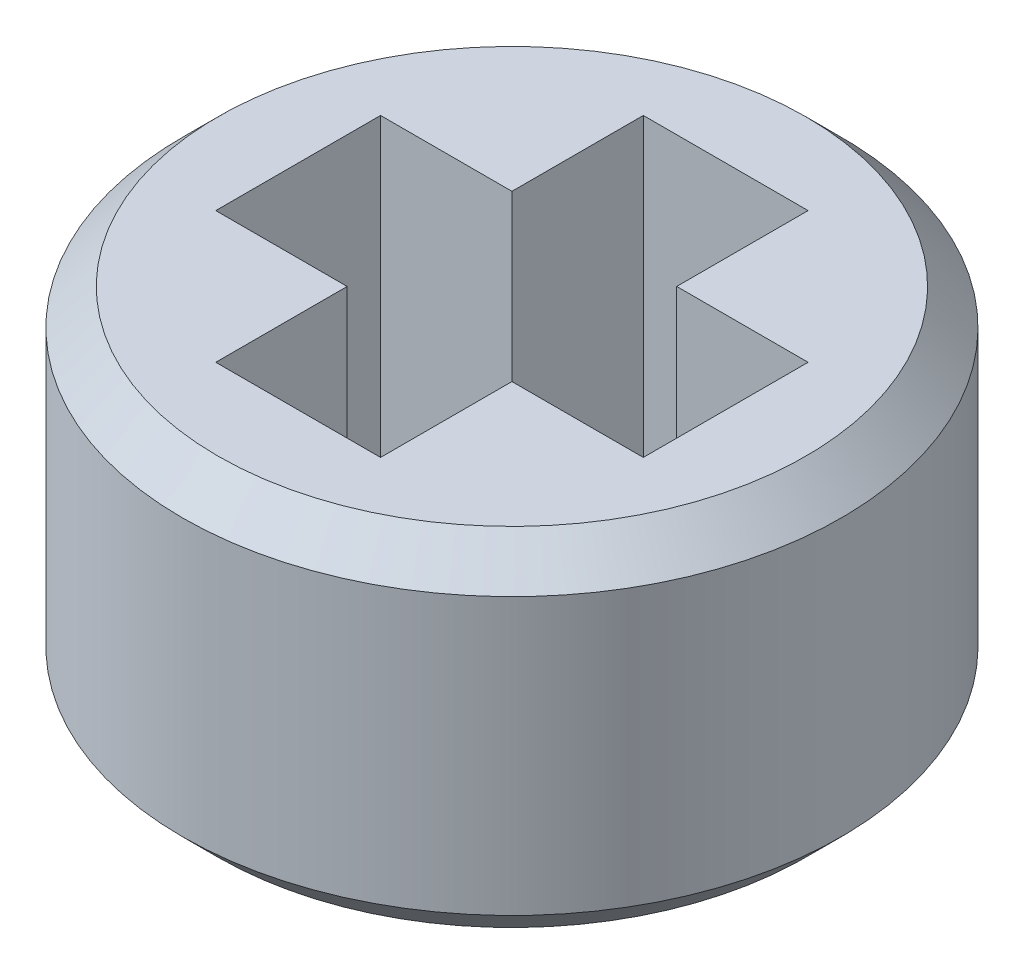
ISO-10303-21;
HEADER;
FILE_DESCRIPTION(('STEP AP214'),'2;1');
FILE_NAME('part.step','',(''),(''),'','','');
FILE_SCHEMA(('AUTOMOTIVE_DESIGN { 1 0 10303 214 1 1 1 1 }'));
ENDSEC;
DATA;
#1=APPLICATION_CONTEXT('core data for automotive mechanical design processes');
#2=APPLICATION_PROTOCOL_DEFINITION('international standard','automotive_design',2000,#1);
#3=PRODUCT_CONTEXT('',#1,'mechanical');
#4=PRODUCT('Part','Part','',(#3));
#5=PRODUCT_RELATED_PRODUCT_CATEGORY('part','',(#4));
#6=PRODUCT_DEFINITION_FORMATION('','',#4);
#7=PRODUCT_DEFINITION_CONTEXT('part definition',#1,'design');
#8=PRODUCT_DEFINITION('design','',#6,#7);
#9=PRODUCT_DEFINITION_SHAPE('','',#8);
#10=(LENGTH_UNIT() NAMED_UNIT(*) SI_UNIT(.MILLI.,.METRE.));
#11=(NAMED_UNIT(*) PLANE_ANGLE_UNIT() SI_UNIT($,.RADIAN.));
#12=(NAMED_UNIT(*) SI_UNIT($,.STERADIAN.) SOLID_ANGLE_UNIT());
#13=UNCERTAINTY_MEASURE_WITH_UNIT(LENGTH_MEASURE(1.E-05),#10,'distance_accuracy_value','');
#14=(GEOMETRIC_REPRESENTATION_CONTEXT(3) GLOBAL_UNCERTAINTY_ASSIGNED_CONTEXT((#13)) GLOBAL_UNIT_ASSIGNED_CONTEXT((#10,
#11,#12)) REPRESENTATION_CONTEXT('',''));
#15=CARTESIAN_POINT('',(0.,0.,0.));
#16=DIRECTION('',(0.,0.,1.));
#17=DIRECTION('',(1.,0.,0.));
#18=AXIS2_PLACEMENT_3D('',#15,#16,#17);
#19=CARTESIAN_POINT('',(0.,1.95,0.));
#20=DIRECTION('',(0.,-1.,0.));
#21=DIRECTION('',(0.,0.,-1.));
#22=AXIS2_PLACEMENT_3D('',#19,#20,#21);
#23=CYLINDRICAL_SURFACE('',#22,3.7);
#24=CARTESIAN_POINT('',(0.,-1.55,0.));
#25=DIRECTION('',(0.,1.,0.));
#26=DIRECTION('',(0.,0.,1.));
#27=AXIS2_PLACEMENT_3D('',#24,#25,#26);
#28=CIRCLE('',#27,3.7);
#29=CARTESIAN_POINT('',(0.,-1.55,3.7));
#30=VERTEX_POINT('',#29);
#31=EDGE_CURVE('E235',#30,#30,#28,.T.);
#32=ORIENTED_EDGE('',*,*,#31,.T.);
#33=EDGE_LOOP('',(#32));
#34=FACE_BOUND('',#33,.T.);
#35=CARTESIAN_POINT('',(0.,1.55,0.));
#36=DIRECTION('',(0.,1.,0.));
#37=DIRECTION('',(0.,0.,1.));
#38=AXIS2_PLACEMENT_3D('',#35,#36,#37);
#39=CIRCLE('',#38,3.7);
#40=CARTESIAN_POINT('',(0.,1.55,3.7));
#41=VERTEX_POINT('',#40);
#42=EDGE_CURVE('E213',#41,#41,#39,.F.);
#43=ORIENTED_EDGE('',*,*,#42,.T.);
#44=EDGE_LOOP('',(#43));
#45=FACE_BOUND('',#44,.T.);
#46=ADVANCED_FACE('F43',(#34,#45),#23,.T.);
#47=CARTESIAN_POINT('',(0.,1.95,0.));
#48=DIRECTION('',(0.,1.,0.));
#49=DIRECTION('',(0.,0.,1.));
#50=AXIS2_PLACEMENT_3D('',#47,#48,#49);
#51=PLANE('',#50);
#52=CARTESIAN_POINT('',(0.,1.95,0.));
#53=DIRECTION('',(0.,1.,0.));
#54=DIRECTION('',(0.,0.,1.));
#55=AXIS2_PLACEMENT_3D('',#52,#53,#54);
#56=CIRCLE('',#55,3.3);
#57=CARTESIAN_POINT('',(0.,1.95,3.3));
#58=VERTEX_POINT('',#57);
#59=EDGE_CURVE('E11',#58,#58,#56,.T.);
#60=ORIENTED_EDGE('',*,*,#59,.T.);
#61=EDGE_LOOP('',(#60));
#62=FACE_BOUND('',#61,.T.);
#63=DIRECTION('',(1.,0.,0.));
#64=VECTOR('',#63,1.);
#65=CARTESIAN_POINT('',(0.925,1.95,0.925));
#66=LINE('',#65,#64);
#67=CARTESIAN_POINT('',(0.925,1.95,0.925));
#68=VERTEX_POINT('',#67);
#69=CARTESIAN_POINT('',(2.4,1.95,0.925));
#70=VERTEX_POINT('',#69);
#71=EDGE_CURVE('E59',#68,#70,#66,.T.);
#72=ORIENTED_EDGE('',*,*,#71,.F.);
#73=DIRECTION('',(0.,0.,-1.));
#74=VECTOR('',#73,1.);
#75=CARTESIAN_POINT('',(0.925,1.95,0.925));
#76=LINE('',#75,#74);
#77=CARTESIAN_POINT('',(0.925,1.95,2.4));
#78=VERTEX_POINT('',#77);
#79=EDGE_CURVE('E151',#78,#68,#76,.T.);
#80=ORIENTED_EDGE('',*,*,#79,.F.);
#81=DIRECTION('',(1.,0.,0.));
#82=VECTOR('',#81,1.);
#83=CARTESIAN_POINT('',(-0.925,1.95,2.4));
#84=LINE('',#83,#82);
#85=CARTESIAN_POINT('',(-0.925,1.95,2.4));
#86=VERTEX_POINT('',#85);
#87=EDGE_CURVE('E154',#86,#78,#84,.T.);
#88=ORIENTED_EDGE('',*,*,#87,.F.);
#89=DIRECTION('',(0.,0.,1.));
#90=VECTOR('',#89,1.);
#91=CARTESIAN_POINT('',(-0.925,1.95,0.925));
#92=LINE('',#91,#90);
#93=CARTESIAN_POINT('',(-0.925,1.95,0.925));
#94=VERTEX_POINT('',#93);
#95=EDGE_CURVE('E206',#94,#86,#92,.T.);
#96=ORIENTED_EDGE('',*,*,#95,.F.);
#97=DIRECTION('',(1.,0.,0.));
#98=VECTOR('',#97,1.);
#99=CARTESIAN_POINT('',(-2.4,1.95,0.925));
#100=LINE('',#99,#98);
#101=CARTESIAN_POINT('',(-2.4,1.95,0.925));
#102=VERTEX_POINT('',#101);
#103=EDGE_CURVE('E203',#102,#94,#100,.T.);
#104=ORIENTED_EDGE('',*,*,#103,.F.);
#105=DIRECTION('',(0.,0.,1.));
#106=VECTOR('',#105,1.);
#107=CARTESIAN_POINT('',(-2.4,1.95,-0.925));
#108=LINE('',#107,#106);
#109=CARTESIAN_POINT('',(-2.4,1.95,-0.925));
#110=VERTEX_POINT('',#109);
#111=EDGE_CURVE('E200',#110,#102,#108,.T.);
#112=ORIENTED_EDGE('',*,*,#111,.F.);
#113=DIRECTION('',(-1.,0.,0.));
#114=VECTOR('',#113,1.);
#115=CARTESIAN_POINT('',(-2.4,1.95,-0.925));
#116=LINE('',#115,#114);
#117=CARTESIAN_POINT('',(-0.925,1.95,-0.925));
#118=VERTEX_POINT('',#117);
#119=EDGE_CURVE('E197',#118,#110,#116,.T.);
#120=ORIENTED_EDGE('',*,*,#119,.F.);
#121=DIRECTION('',(0.,0.,1.));
#122=VECTOR('',#121,1.);
#123=CARTESIAN_POINT('',(-0.925000000000001,1.95,-2.4));
#124=LINE('',#123,#122);
#125=CARTESIAN_POINT('',(-0.925000000000001,1.95,-2.4));
#126=VERTEX_POINT('',#125);
#127=EDGE_CURVE('E194',#126,#118,#124,.T.);
#128=ORIENTED_EDGE('',*,*,#127,.F.);
#129=DIRECTION('',(-1.,0.,0.));
#130=VECTOR('',#129,1.);
#131=CARTESIAN_POINT('',(-0.925000000000001,1.95,-2.4));
#132=LINE('',#131,#130);
#133=CARTESIAN_POINT('',(0.924999999999999,1.95,-2.4));
#134=VERTEX_POINT('',#133);
#135=EDGE_CURVE('E191',#134,#126,#132,.T.);
#136=ORIENTED_EDGE('',*,*,#135,.F.);
#137=DIRECTION('',(0.,0.,-1.));
#138=VECTOR('',#137,1.);
#139=CARTESIAN_POINT('',(0.924999999999999,1.95,-2.4));
#140=LINE('',#139,#138);
#141=CARTESIAN_POINT('',(0.924999999999999,1.95,-0.925));
#142=VERTEX_POINT('',#141);
#143=EDGE_CURVE('E188',#142,#134,#140,.T.);
#144=ORIENTED_EDGE('',*,*,#143,.F.);
#145=DIRECTION('',(-1.,0.,0.));
#146=VECTOR('',#145,1.);
#147=CARTESIAN_POINT('',(0.924999999999999,1.95,-0.925));
#148=LINE('',#147,#146);
#149=CARTESIAN_POINT('',(2.4,1.95,-0.925));
#150=VERTEX_POINT('',#149);
#151=EDGE_CURVE('E185',#150,#142,#148,.T.);
#152=ORIENTED_EDGE('',*,*,#151,.F.);
#153=DIRECTION('',(0.,0.,-1.));
#154=VECTOR('',#153,1.);
#155=CARTESIAN_POINT('',(2.4,1.95,-0.925));
#156=LINE('',#155,#154);
#157=EDGE_CURVE('E183',#70,#150,#156,.T.);
#158=ORIENTED_EDGE('',*,*,#157,.F.);
#159=EDGE_LOOP('',(#72,#80,#88,#96,#104,#112,#120,#128,#136,#144,#152,#158));
#160=FACE_BOUND('',#159,.T.);
#161=ADVANCED_FACE('F248',(#62,#160),#51,.T.);
#162=CARTESIAN_POINT('',(0.,-1.95,0.));
#163=DIRECTION('',(0.,1.,0.));
#164=DIRECTION('',(0.,0.,1.));
#165=AXIS2_PLACEMENT_3D('',#162,#163,#164);
#166=PLANE('',#165);
#167=CARTESIAN_POINT('',(0.,-1.95,0.));
#168=DIRECTION('',(0.,1.,0.));
#169=DIRECTION('',(0.,0.,1.));
#170=AXIS2_PLACEMENT_3D('',#167,#168,#169);
#171=CIRCLE('',#170,3.3);
#172=CARTESIAN_POINT('',(0.,-1.95,3.3));
#173=VERTEX_POINT('',#172);
#174=EDGE_CURVE('E52',#173,#173,#171,.F.);
#175=ORIENTED_EDGE('',*,*,#174,.T.);
#176=EDGE_LOOP('',(#175));
#177=FACE_BOUND('',#176,.T.);
#178=DIRECTION('',(0.,0.,-1.));
#179=VECTOR('',#178,1.);
#180=CARTESIAN_POINT('',(0.925,-1.95,0.925));
#181=LINE('',#180,#179);
#182=CARTESIAN_POINT('',(0.925,-1.95,2.4));
#183=VERTEX_POINT('',#182);
#184=CARTESIAN_POINT('',(0.925,-1.95,0.925));
#185=VERTEX_POINT('',#184);
#186=EDGE_CURVE('E141',#183,#185,#181,.T.);
#187=ORIENTED_EDGE('',*,*,#186,.T.);
#188=DIRECTION('',(1.,0.,0.));
#189=VECTOR('',#188,1.);
#190=CARTESIAN_POINT('',(0.925,-1.95,0.925));
#191=LINE('',#190,#189);
#192=CARTESIAN_POINT('',(2.4,-1.95,0.925));
#193=VERTEX_POINT('',#192);
#194=EDGE_CURVE('E135',#185,#193,#191,.T.);
#195=ORIENTED_EDGE('',*,*,#194,.T.);
#196=DIRECTION('',(0.,0.,-1.));
#197=VECTOR('',#196,1.);
#198=CARTESIAN_POINT('',(2.4,-1.95,-0.925));
#199=LINE('',#198,#197);
#200=CARTESIAN_POINT('',(2.4,-1.95,-0.925));
#201=VERTEX_POINT('',#200);
#202=EDGE_CURVE('E144',#193,#201,#199,.T.);
#203=ORIENTED_EDGE('',*,*,#202,.T.);
#204=DIRECTION('',(-1.,0.,0.));
#205=VECTOR('',#204,1.);
#206=CARTESIAN_POINT('',(0.924999999999999,-1.95,-0.925));
#207=LINE('',#206,#205);
#208=CARTESIAN_POINT('',(0.924999999999999,-1.95,-0.925));
#209=VERTEX_POINT('',#208);
#210=EDGE_CURVE('E67',#201,#209,#207,.T.);
#211=ORIENTED_EDGE('',*,*,#210,.T.);
#212=DIRECTION('',(0.,0.,-1.));
#213=VECTOR('',#212,1.);
#214=CARTESIAN_POINT('',(0.924999999999999,-1.95,-2.4));
#215=LINE('',#214,#213);
#216=CARTESIAN_POINT('',(0.924999999999999,-1.95,-2.4));
#217=VERTEX_POINT('',#216);
#218=EDGE_CURVE('E158',#209,#217,#215,.T.);
#219=ORIENTED_EDGE('',*,*,#218,.T.);
#220=DIRECTION('',(-1.,0.,0.));
#221=VECTOR('',#220,1.);
#222=CARTESIAN_POINT('',(-0.925000000000001,-1.95,-2.4));
#223=LINE('',#222,#221);
#224=CARTESIAN_POINT('',(-0.925000000000001,-1.95,-2.4));
#225=VERTEX_POINT('',#224);
#226=EDGE_CURVE('E161',#217,#225,#223,.T.);
#227=ORIENTED_EDGE('',*,*,#226,.T.);
#228=DIRECTION('',(0.,0.,1.));
#229=VECTOR('',#228,1.);
#230=CARTESIAN_POINT('',(-0.925000000000001,-1.95,-2.4));
#231=LINE('',#230,#229);
#232=CARTESIAN_POINT('',(-0.925,-1.95,-0.925));
#233=VERTEX_POINT('',#232);
#234=EDGE_CURVE('E164',#225,#233,#231,.T.);
#235=ORIENTED_EDGE('',*,*,#234,.T.);
#236=DIRECTION('',(-1.,0.,0.));
#237=VECTOR('',#236,1.);
#238=CARTESIAN_POINT('',(-2.4,-1.95,-0.925));
#239=LINE('',#238,#237);
#240=CARTESIAN_POINT('',(-2.4,-1.95,-0.925));
#241=VERTEX_POINT('',#240);
#242=EDGE_CURVE('E167',#233,#241,#239,.T.);
#243=ORIENTED_EDGE('',*,*,#242,.T.);
#244=DIRECTION('',(0.,0.,1.));
#245=VECTOR('',#244,1.);
#246=CARTESIAN_POINT('',(-2.4,-1.95,-0.925));
#247=LINE('',#246,#245);
#248=CARTESIAN_POINT('',(-2.4,-1.95,0.925));
#249=VERTEX_POINT('',#248);
#250=EDGE_CURVE('E170',#241,#249,#247,.T.);
#251=ORIENTED_EDGE('',*,*,#250,.T.);
#252=DIRECTION('',(1.,0.,0.));
#253=VECTOR('',#252,1.);
#254=CARTESIAN_POINT('',(-2.4,-1.95,0.925));
#255=LINE('',#254,#253);
#256=CARTESIAN_POINT('',(-0.925,-1.95,0.925));
#257=VERTEX_POINT('',#256);
#258=EDGE_CURVE('E173',#249,#257,#255,.T.);
#259=ORIENTED_EDGE('',*,*,#258,.T.);
#260=DIRECTION('',(0.,0.,1.));
#261=VECTOR('',#260,1.);
#262=CARTESIAN_POINT('',(-0.925,-1.95,0.925));
#263=LINE('',#262,#261);
#264=CARTESIAN_POINT('',(-0.925,-1.95,2.4));
#265=VERTEX_POINT('',#264);
#266=EDGE_CURVE('E176',#257,#265,#263,.T.);
#267=ORIENTED_EDGE('',*,*,#266,.T.);
#268=DIRECTION('',(1.,0.,0.));
#269=VECTOR('',#268,1.);
#270=CARTESIAN_POINT('',(-0.925,-1.95,2.4));
#271=LINE('',#270,#269);
#272=EDGE_CURVE('E179',#265,#183,#271,.T.);
#273=ORIENTED_EDGE('',*,*,#272,.T.);
#274=EDGE_LOOP('',(#187,#195,#203,#211,#219,#227,#235,#243,#251,#259,#267,#273));
#275=FACE_BOUND('',#274,.T.);
#276=ADVANCED_FACE('F148',(#177,#275),#166,.F.);
#277=CARTESIAN_POINT('',(0.925,-1.95,0.925));
#278=DIRECTION('',(0.,0.,1.));
#279=DIRECTION('',(1.,0.,0.));
#280=AXIS2_PLACEMENT_3D('',#277,#278,#279);
#281=PLANE('',#280);
#282=ORIENTED_EDGE('',*,*,#71,.T.);
#283=DIRECTION('',(0.,1.,0.));
#284=VECTOR('',#283,1.);
#285=CARTESIAN_POINT('',(2.4,-1.95,0.925));
#286=LINE('',#285,#284);
#287=EDGE_CURVE('E131',#193,#70,#286,.T.);
#288=ORIENTED_EDGE('',*,*,#287,.F.);
#289=ORIENTED_EDGE('',*,*,#194,.F.);
#290=DIRECTION('',(0.,1.,0.));
#291=VECTOR('',#290,1.);
#292=CARTESIAN_POINT('',(0.925,-1.95,0.925));
#293=LINE('',#292,#291);
#294=EDGE_CURVE('E211',#185,#68,#293,.T.);
#295=ORIENTED_EDGE('',*,*,#294,.T.);
#296=EDGE_LOOP('',(#282,#288,#289,#295));
#297=FACE_BOUND('',#296,.T.);
#298=ADVANCED_FACE('F133',(#297),#281,.F.);
#299=CARTESIAN_POINT('',(0.925,-1.95,0.925));
#300=DIRECTION('',(1.,0.,0.));
#301=DIRECTION('',(0.,0.,-1.));
#302=AXIS2_PLACEMENT_3D('',#299,#300,#301);
#303=PLANE('',#302);
#304=ORIENTED_EDGE('',*,*,#79,.T.);
#305=ORIENTED_EDGE('',*,*,#294,.F.);
#306=ORIENTED_EDGE('',*,*,#186,.F.);
#307=DIRECTION('',(0.,1.,0.));
#308=VECTOR('',#307,1.);
#309=CARTESIAN_POINT('',(0.925,-1.95,2.4));
#310=LINE('',#309,#308);
#311=EDGE_CURVE('E214',#183,#78,#310,.T.);
#312=ORIENTED_EDGE('',*,*,#311,.T.);
#313=EDGE_LOOP('',(#304,#305,#306,#312));
#314=FACE_BOUND('',#313,.T.);
#315=ADVANCED_FACE('F295',(#314),#303,.F.);
#316=CARTESIAN_POINT('',(-0.925,-1.95,2.4));
#317=DIRECTION('',(0.,0.,1.));
#318=DIRECTION('',(1.,0.,0.));
#319=AXIS2_PLACEMENT_3D('',#316,#317,#318);
#320=PLANE('',#319);
#321=ORIENTED_EDGE('',*,*,#87,.T.);
#322=ORIENTED_EDGE('',*,*,#311,.F.);
#323=ORIENTED_EDGE('',*,*,#272,.F.);
#324=DIRECTION('',(0.,1.,0.));
#325=VECTOR('',#324,1.);
#326=CARTESIAN_POINT('',(-0.925,-1.95,2.4));
#327=LINE('',#326,#325);
#328=EDGE_CURVE('E216',#265,#86,#327,.T.);
#329=ORIENTED_EDGE('',*,*,#328,.T.);
#330=EDGE_LOOP('',(#321,#322,#323,#329));
#331=FACE_BOUND('',#330,.T.);
#332=ADVANCED_FACE('F293',(#331),#320,.F.);
#333=CARTESIAN_POINT('',(-0.925,-1.95,0.925));
#334=DIRECTION('',(-1.,0.,0.));
#335=DIRECTION('',(0.,0.,1.));
#336=AXIS2_PLACEMENT_3D('',#333,#334,#335);
#337=PLANE('',#336);
#338=ORIENTED_EDGE('',*,*,#95,.T.);
#339=ORIENTED_EDGE('',*,*,#328,.F.);
#340=ORIENTED_EDGE('',*,*,#266,.F.);
#341=DIRECTION('',(0.,1.,0.));
#342=VECTOR('',#341,1.);
#343=CARTESIAN_POINT('',(-0.925,-1.95,0.925));
#344=LINE('',#343,#342);
#345=EDGE_CURVE('E218',#257,#94,#344,.T.);
#346=ORIENTED_EDGE('',*,*,#345,.T.);
#347=EDGE_LOOP('',(#338,#339,#340,#346));
#348=FACE_BOUND('',#347,.T.);
#349=ADVANCED_FACE('F290',(#348),#337,.F.);
#350=CARTESIAN_POINT('',(-2.4,-1.95,0.925));
#351=DIRECTION('',(0.,0.,1.));
#352=DIRECTION('',(1.,0.,0.));
#353=AXIS2_PLACEMENT_3D('',#350,#351,#352);
#354=PLANE('',#353);
#355=ORIENTED_EDGE('',*,*,#103,.T.);
#356=ORIENTED_EDGE('',*,*,#345,.F.);
#357=ORIENTED_EDGE('',*,*,#258,.F.);
#358=DIRECTION('',(0.,1.,0.));
#359=VECTOR('',#358,1.);
#360=CARTESIAN_POINT('',(-2.4,-1.95,0.925));
#361=LINE('',#360,#359);
#362=EDGE_CURVE('E220',#249,#102,#361,.T.);
#363=ORIENTED_EDGE('',*,*,#362,.T.);
#364=EDGE_LOOP('',(#355,#356,#357,#363));
#365=FACE_BOUND('',#364,.T.);
#366=ADVANCED_FACE('F286',(#365),#354,.F.);
#367=CARTESIAN_POINT('',(-2.4,-1.95,-0.925));
#368=DIRECTION('',(-1.,0.,0.));
#369=DIRECTION('',(0.,0.,1.));
#370=AXIS2_PLACEMENT_3D('',#367,#368,#369);
#371=PLANE('',#370);
#372=ORIENTED_EDGE('',*,*,#111,.T.);
#373=ORIENTED_EDGE('',*,*,#362,.F.);
#374=ORIENTED_EDGE('',*,*,#250,.F.);
#375=DIRECTION('',(0.,1.,0.));
#376=VECTOR('',#375,1.);
#377=CARTESIAN_POINT('',(-2.4,-1.95,-0.925));
#378=LINE('',#377,#376);
#379=EDGE_CURVE('E222',#241,#110,#378,.T.);
#380=ORIENTED_EDGE('',*,*,#379,.T.);
#381=EDGE_LOOP('',(#372,#373,#374,#380));
#382=FACE_BOUND('',#381,.T.);
#383=ADVANCED_FACE('F282',(#382),#371,.F.);
#384=CARTESIAN_POINT('',(-2.4,-1.95,-0.925));
#385=DIRECTION('',(0.,0.,-1.));
#386=DIRECTION('',(-1.,0.,0.));
#387=AXIS2_PLACEMENT_3D('',#384,#385,#386);
#388=PLANE('',#387);
#389=ORIENTED_EDGE('',*,*,#119,.T.);
#390=ORIENTED_EDGE('',*,*,#379,.F.);
#391=ORIENTED_EDGE('',*,*,#242,.F.);
#392=DIRECTION('',(0.,1.,0.));
#393=VECTOR('',#392,1.);
#394=CARTESIAN_POINT('',(-0.925,-1.95,-0.925));
#395=LINE('',#394,#393);
#396=EDGE_CURVE('E224',#233,#118,#395,.T.);
#397=ORIENTED_EDGE('',*,*,#396,.T.);
#398=EDGE_LOOP('',(#389,#390,#391,#397));
#399=FACE_BOUND('',#398,.T.);
#400=ADVANCED_FACE('F278',(#399),#388,.F.);
#401=CARTESIAN_POINT('',(-0.925000000000001,-1.95,-2.4));
#402=DIRECTION('',(-1.,0.,0.));
#403=DIRECTION('',(0.,0.,1.));
#404=AXIS2_PLACEMENT_3D('',#401,#402,#403);
#405=PLANE('',#404);
#406=ORIENTED_EDGE('',*,*,#127,.T.);
#407=ORIENTED_EDGE('',*,*,#396,.F.);
#408=ORIENTED_EDGE('',*,*,#234,.F.);
#409=DIRECTION('',(0.,1.,0.));
#410=VECTOR('',#409,1.);
#411=CARTESIAN_POINT('',(-0.925000000000001,-1.95,-2.4));
#412=LINE('',#411,#410);
#413=EDGE_CURVE('E226',#225,#126,#412,.T.);
#414=ORIENTED_EDGE('',*,*,#413,.T.);
#415=EDGE_LOOP('',(#406,#407,#408,#414));
#416=FACE_BOUND('',#415,.T.);
#417=ADVANCED_FACE('F274',(#416),#405,.F.);
#418=CARTESIAN_POINT('',(-0.925000000000001,-1.95,-2.4));
#419=DIRECTION('',(0.,0.,-1.));
#420=DIRECTION('',(-1.,0.,0.));
#421=AXIS2_PLACEMENT_3D('',#418,#419,#420);
#422=PLANE('',#421);
#423=ORIENTED_EDGE('',*,*,#135,.T.);
#424=ORIENTED_EDGE('',*,*,#413,.F.);
#425=ORIENTED_EDGE('',*,*,#226,.F.);
#426=DIRECTION('',(0.,1.,0.));
#427=VECTOR('',#426,1.);
#428=CARTESIAN_POINT('',(0.924999999999999,-1.95,-2.4));
#429=LINE('',#428,#427);
#430=EDGE_CURVE('E228',#217,#134,#429,.T.);
#431=ORIENTED_EDGE('',*,*,#430,.T.);
#432=EDGE_LOOP('',(#423,#424,#425,#431));
#433=FACE_BOUND('',#432,.T.);
#434=ADVANCED_FACE('F271',(#433),#422,.F.);
#435=CARTESIAN_POINT('',(0.924999999999999,-1.95,-2.4));
#436=DIRECTION('',(1.,0.,0.));
#437=DIRECTION('',(0.,0.,-1.));
#438=AXIS2_PLACEMENT_3D('',#435,#436,#437);
#439=PLANE('',#438);
#440=ORIENTED_EDGE('',*,*,#143,.T.);
#441=ORIENTED_EDGE('',*,*,#430,.F.);
#442=ORIENTED_EDGE('',*,*,#218,.F.);
#443=DIRECTION('',(0.,1.,0.));
#444=VECTOR('',#443,1.);
#445=CARTESIAN_POINT('',(0.924999999999999,-1.95,-0.925));
#446=LINE('',#445,#444);
#447=EDGE_CURVE('E230',#209,#142,#446,.T.);
#448=ORIENTED_EDGE('',*,*,#447,.T.);
#449=EDGE_LOOP('',(#440,#441,#442,#448));
#450=FACE_BOUND('',#449,.T.);
#451=ADVANCED_FACE('F267',(#450),#439,.F.);
#452=CARTESIAN_POINT('',(0.924999999999999,-1.95,-0.925));
#453=DIRECTION('',(0.,0.,-1.));
#454=DIRECTION('',(-1.,0.,0.));
#455=AXIS2_PLACEMENT_3D('',#452,#453,#454);
#456=PLANE('',#455);
#457=ORIENTED_EDGE('',*,*,#151,.T.);
#458=ORIENTED_EDGE('',*,*,#447,.F.);
#459=ORIENTED_EDGE('',*,*,#210,.F.);
#460=DIRECTION('',(0.,1.,0.));
#461=VECTOR('',#460,1.);
#462=CARTESIAN_POINT('',(2.4,-1.95,-0.925));
#463=LINE('',#462,#461);
#464=EDGE_CURVE('E140',#201,#150,#463,.T.);
#465=ORIENTED_EDGE('',*,*,#464,.T.);
#466=EDGE_LOOP('',(#457,#458,#459,#465));
#467=FACE_BOUND('',#466,.T.);
#468=ADVANCED_FACE('F264',(#467),#456,.F.);
#469=CARTESIAN_POINT('',(2.4,-1.95,-0.925));
#470=DIRECTION('',(1.,0.,0.));
#471=DIRECTION('',(0.,0.,-1.));
#472=AXIS2_PLACEMENT_3D('',#469,#470,#471);
#473=PLANE('',#472);
#474=ORIENTED_EDGE('',*,*,#157,.T.);
#475=ORIENTED_EDGE('',*,*,#464,.F.);
#476=ORIENTED_EDGE('',*,*,#202,.F.);
#477=ORIENTED_EDGE('',*,*,#287,.T.);
#478=EDGE_LOOP('',(#474,#475,#476,#477));
#479=FACE_BOUND('',#478,.T.);
#480=ADVANCED_FACE('F145',(#479),#473,.F.);
#481=CARTESIAN_POINT('',(0.,-1.55,0.));
#482=DIRECTION('',(0.,1.,0.));
#483=DIRECTION('',(0.,0.,1.));
#484=AXIS2_PLACEMENT_3D('',#481,#482,#483);
#485=CONICAL_SURFACE('',#484,3.7,0.78539816339745);
#486=ORIENTED_EDGE('',*,*,#174,.F.);
#487=EDGE_LOOP('',(#486));
#488=FACE_BOUND('',#487,.T.);
#489=ORIENTED_EDGE('',*,*,#31,.F.);
#490=EDGE_LOOP('',(#489));
#491=FACE_BOUND('',#490,.T.);
#492=ADVANCED_FACE('F241',(#488,#491),#485,.T.);
#493=CARTESIAN_POINT('',(0.,1.95,0.));
#494=DIRECTION('',(0.,-1.,0.));
#495=DIRECTION('',(0.,0.,-1.));
#496=AXIS2_PLACEMENT_3D('',#493,#494,#495);
#497=CONICAL_SURFACE('',#496,3.3,0.785398163397446);
#498=ORIENTED_EDGE('',*,*,#42,.F.);
#499=EDGE_LOOP('',(#498));
#500=FACE_BOUND('',#499,.T.);
#501=ORIENTED_EDGE('',*,*,#59,.F.);
#502=EDGE_LOOP('',(#501));
#503=FACE_BOUND('',#502,.T.);
#504=ADVANCED_FACE('F46',(#500,#503),#497,.T.);
#505=CLOSED_SHELL('',(#46,#161,#276,#298,#315,#332,#349,#366,#383,#400,#417,#434,#451,#468,#480,
#492,#504));
#506=MANIFOLD_SOLID_BREP('B2',#505);
#507=ADVANCED_BREP_SHAPE_REPRESENTATION('',(#18,#506),#14);
#508=SHAPE_DEFINITION_REPRESENTATION(#9,#507);
ENDSEC;
END-ISO-10303-21;
